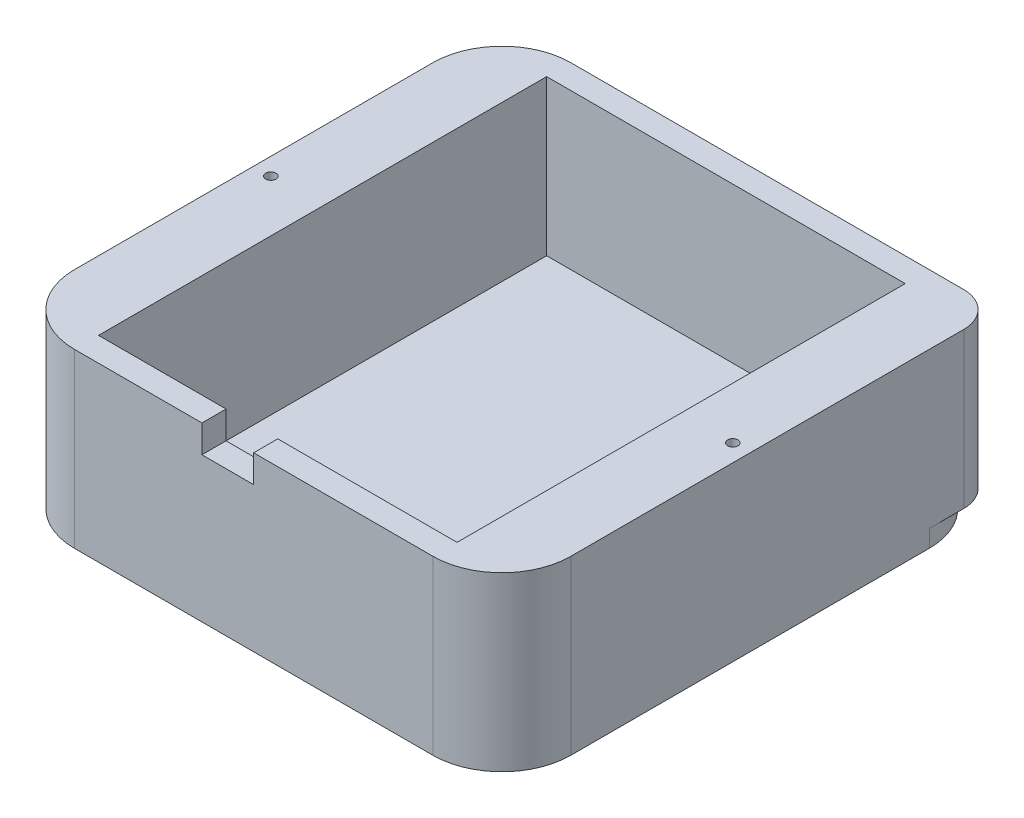
ISO-10303-21;
HEADER;
FILE_DESCRIPTION(('STEP AP214'),'2;1');
FILE_NAME('part.step','',(''),(''),'','','');
FILE_SCHEMA(('AUTOMOTIVE_DESIGN { 1 0 10303 214 1 1 1 1 }'));
ENDSEC;
DATA;
#1=APPLICATION_CONTEXT('core data for automotive mechanical design processes');
#2=APPLICATION_PROTOCOL_DEFINITION('international standard','automotive_design',2000,#1);
#3=PRODUCT_CONTEXT('',#1,'mechanical');
#4=PRODUCT('Part','Part','',(#3));
#5=PRODUCT_RELATED_PRODUCT_CATEGORY('part','',(#4));
#6=PRODUCT_DEFINITION_FORMATION('','',#4);
#7=PRODUCT_DEFINITION_CONTEXT('part definition',#1,'design');
#8=PRODUCT_DEFINITION('design','',#6,#7);
#9=PRODUCT_DEFINITION_SHAPE('','',#8);
#10=(LENGTH_UNIT() NAMED_UNIT(*) SI_UNIT(.MILLI.,.METRE.));
#11=(NAMED_UNIT(*) PLANE_ANGLE_UNIT() SI_UNIT($,.RADIAN.));
#12=(NAMED_UNIT(*) SI_UNIT($,.STERADIAN.) SOLID_ANGLE_UNIT());
#13=UNCERTAINTY_MEASURE_WITH_UNIT(LENGTH_MEASURE(1.E-05),#10,'distance_accuracy_value','');
#14=(GEOMETRIC_REPRESENTATION_CONTEXT(3) GLOBAL_UNCERTAINTY_ASSIGNED_CONTEXT((#13)) GLOBAL_UNIT_ASSIGNED_CONTEXT((#10,
#11,#12)) REPRESENTATION_CONTEXT('',''));
#15=CARTESIAN_POINT('',(0.,0.,0.));
#16=DIRECTION('',(0.,0.,1.));
#17=DIRECTION('',(1.,0.,0.));
#18=AXIS2_PLACEMENT_3D('',#15,#16,#17);
#19=CARTESIAN_POINT('',(72.,5.,-72.));
#20=DIRECTION('',(-1.,0.,0.));
#21=DIRECTION('',(0.,0.,1.));
#22=AXIS2_PLACEMENT_3D('',#19,#20,#21);
#23=PLANE('',#22);
#24=DIRECTION('',(0.,0.,-1.));
#25=VECTOR('',#24,1.);
#26=CARTESIAN_POINT('',(72.,0.,-72.));
#27=LINE('',#26,#25);
#28=CARTESIAN_POINT('',(72.,0.,52.));
#29=VERTEX_POINT('',#28);
#30=CARTESIAN_POINT('',(72.,0.,-52.));
#31=VERTEX_POINT('',#30);
#32=EDGE_CURVE('E221',#29,#31,#27,.T.);
#33=ORIENTED_EDGE('',*,*,#32,.T.);
#34=DIRECTION('',(0.,-1.,0.));
#35=VECTOR('',#34,1.);
#36=CARTESIAN_POINT('',(72.,5.,-52.));
#37=LINE('',#36,#35);
#38=CARTESIAN_POINT('',(72.,5.,-52.));
#39=VERTEX_POINT('',#38);
#40=EDGE_CURVE('E256',#31,#39,#37,.F.);
#41=ORIENTED_EDGE('',*,*,#40,.T.);
#42=DIRECTION('',(0.,0.,-1.));
#43=VECTOR('',#42,1.);
#44=CARTESIAN_POINT('',(72.,5.,-62.));
#45=LINE('',#44,#43);
#46=CARTESIAN_POINT('',(72.,5.,-62.));
#47=VERTEX_POINT('',#46);
#48=EDGE_CURVE('E207',#39,#47,#45,.T.);
#49=ORIENTED_EDGE('',*,*,#48,.T.);
#50=DIRECTION('',(0.,-1.,0.));
#51=VECTOR('',#50,1.);
#52=CARTESIAN_POINT('',(72.,50.,-62.));
#53=LINE('',#52,#51);
#54=CARTESIAN_POINT('',(72.,50.,-62.));
#55=VERTEX_POINT('',#54);
#56=EDGE_CURVE('E218',#55,#47,#53,.T.);
#57=ORIENTED_EDGE('',*,*,#56,.F.);
#58=DIRECTION('',(0.,0.,-1.));
#59=VECTOR('',#58,1.);
#60=CARTESIAN_POINT('',(72.,50.,-62.));
#61=LINE('',#60,#59);
#62=CARTESIAN_POINT('',(72.,50.,52.));
#63=VERTEX_POINT('',#62);
#64=EDGE_CURVE('E199',#63,#55,#61,.T.);
#65=ORIENTED_EDGE('',*,*,#64,.F.);
#66=DIRECTION('',(0.,-1.,0.));
#67=VECTOR('',#66,1.);
#68=CARTESIAN_POINT('',(72.,5.,52.));
#69=LINE('',#68,#67);
#70=EDGE_CURVE('E253',#63,#29,#69,.T.);
#71=ORIENTED_EDGE('',*,*,#70,.T.);
#72=EDGE_LOOP('',(#33,#41,#49,#57,#65,#71));
#73=FACE_BOUND('',#72,.T.);
#74=ADVANCED_FACE('F35',(#73),#23,.F.);
#75=CARTESIAN_POINT('',(-72.,5.,-72.));
#76=DIRECTION('',(0.,0.,1.));
#77=DIRECTION('',(1.,0.,0.));
#78=AXIS2_PLACEMENT_3D('',#75,#76,#77);
#79=PLANE('',#78);
#80=DIRECTION('',(-1.,0.,0.));
#81=VECTOR('',#80,1.);
#82=CARTESIAN_POINT('',(-72.,0.,-72.));
#83=LINE('',#82,#81);
#84=CARTESIAN_POINT('',(52.,0.,-72.));
#85=VERTEX_POINT('',#84);
#86=CARTESIAN_POINT('',(-52.,0.,-72.));
#87=VERTEX_POINT('',#86);
#88=EDGE_CURVE('E224',#85,#87,#83,.T.);
#89=ORIENTED_EDGE('',*,*,#88,.T.);
#90=DIRECTION('',(0.,-1.,0.));
#91=VECTOR('',#90,1.);
#92=CARTESIAN_POINT('',(-52.,5.,-72.));
#93=LINE('',#92,#91);
#94=CARTESIAN_POINT('',(-52.,50.,-72.));
#95=VERTEX_POINT('',#94);
#96=EDGE_CURVE('E248',#87,#95,#93,.F.);
#97=ORIENTED_EDGE('',*,*,#96,.T.);
#98=DIRECTION('',(-1.,0.,0.));
#99=VECTOR('',#98,1.);
#100=CARTESIAN_POINT('',(-52.,50.,-72.));
#101=LINE('',#100,#99);
#102=CARTESIAN_POINT('',(62.,50.,-72.));
#103=VERTEX_POINT('',#102);
#104=EDGE_CURVE('E203',#103,#95,#101,.T.);
#105=ORIENTED_EDGE('',*,*,#104,.F.);
#106=DIRECTION('',(0.,-1.,0.));
#107=VECTOR('',#106,1.);
#108=CARTESIAN_POINT('',(62.,50.,-72.));
#109=LINE('',#108,#107);
#110=CARTESIAN_POINT('',(62.,5.,-72.));
#111=VERTEX_POINT('',#110);
#112=EDGE_CURVE('E206',#103,#111,#109,.T.);
#113=ORIENTED_EDGE('',*,*,#112,.T.);
#114=DIRECTION('',(-1.,0.,0.));
#115=VECTOR('',#114,1.);
#116=CARTESIAN_POINT('',(-52.,5.,-72.));
#117=LINE('',#116,#115);
#118=CARTESIAN_POINT('',(52.,5.,-72.));
#119=VERTEX_POINT('',#118);
#120=EDGE_CURVE('E212',#111,#119,#117,.T.);
#121=ORIENTED_EDGE('',*,*,#120,.T.);
#122=DIRECTION('',(0.,-1.,0.));
#123=VECTOR('',#122,1.);
#124=CARTESIAN_POINT('',(52.,5.,-72.));
#125=LINE('',#124,#123);
#126=EDGE_CURVE('E245',#119,#85,#125,.T.);
#127=ORIENTED_EDGE('',*,*,#126,.T.);
#128=EDGE_LOOP('',(#89,#97,#105,#113,#121,#127));
#129=FACE_BOUND('',#128,.T.);
#130=ADVANCED_FACE('F347',(#129),#79,.F.);
#131=CARTESIAN_POINT('',(-72.,5.,-72.));
#132=DIRECTION('',(1.,0.,0.));
#133=DIRECTION('',(0.,0.,-1.));
#134=AXIS2_PLACEMENT_3D('',#131,#132,#133);
#135=PLANE('',#134);
#136=DIRECTION('',(0.,-1.,0.));
#137=VECTOR('',#136,1.);
#138=CARTESIAN_POINT('',(-72.,5.,52.));
#139=LINE('',#138,#137);
#140=CARTESIAN_POINT('',(-72.,0.,52.));
#141=VERTEX_POINT('',#140);
#142=CARTESIAN_POINT('',(-72.,50.,52.));
#143=VERTEX_POINT('',#142);
#144=EDGE_CURVE('E232',#141,#143,#139,.F.);
#145=ORIENTED_EDGE('',*,*,#144,.T.);
#146=DIRECTION('',(0.,0.,1.));
#147=VECTOR('',#146,1.);
#148=CARTESIAN_POINT('',(-72.,50.,-52.));
#149=LINE('',#148,#147);
#150=CARTESIAN_POINT('',(-72.,50.,-52.));
#151=VERTEX_POINT('',#150);
#152=EDGE_CURVE('E194',#151,#143,#149,.T.);
#153=ORIENTED_EDGE('',*,*,#152,.F.);
#154=DIRECTION('',(0.,-1.,0.));
#155=VECTOR('',#154,1.);
#156=CARTESIAN_POINT('',(-72.,5.,-52.));
#157=LINE('',#156,#155);
#158=CARTESIAN_POINT('',(-72.,0.,-52.));
#159=VERTEX_POINT('',#158);
#160=EDGE_CURVE('E234',#151,#159,#157,.T.);
#161=ORIENTED_EDGE('',*,*,#160,.T.);
#162=DIRECTION('',(0.,0.,1.));
#163=VECTOR('',#162,1.);
#164=CARTESIAN_POINT('',(-72.,0.,-72.));
#165=LINE('',#164,#163);
#166=EDGE_CURVE('E227',#159,#141,#165,.T.);
#167=ORIENTED_EDGE('',*,*,#166,.T.);
#168=EDGE_LOOP('',(#145,#153,#161,#167));
#169=FACE_BOUND('',#168,.T.);
#170=ADVANCED_FACE('F352',(#169),#135,.F.);
#171=CARTESIAN_POINT('',(-72.,5.,72.));
#172=DIRECTION('',(0.,0.,-1.));
#173=DIRECTION('',(-1.,0.,0.));
#174=AXIS2_PLACEMENT_3D('',#171,#172,#173);
#175=PLANE('',#174);
#176=DIRECTION('',(1.,0.,0.));
#177=VECTOR('',#176,1.);
#178=CARTESIAN_POINT('',(52.,50.,72.));
#179=LINE('',#178,#177);
#180=CARTESIAN_POINT('',(0.,50.,72.));
#181=VERTEX_POINT('',#180);
#182=CARTESIAN_POINT('',(52.,50.,72.));
#183=VERTEX_POINT('',#182);
#184=EDGE_CURVE('E176',#181,#183,#179,.T.);
#185=ORIENTED_EDGE('',*,*,#184,.F.);
#186=DIRECTION('',(0.,1.,0.));
#187=VECTOR('',#186,1.);
#188=CARTESIAN_POINT('',(0.,42.,72.));
#189=LINE('',#188,#187);
#190=CARTESIAN_POINT('',(0.,42.,72.));
#191=VERTEX_POINT('',#190);
#192=EDGE_CURVE('E159',#191,#181,#189,.T.);
#193=ORIENTED_EDGE('',*,*,#192,.F.);
#194=DIRECTION('',(1.,0.,0.));
#195=VECTOR('',#194,1.);
#196=CARTESIAN_POINT('',(-15.,42.,72.));
#197=LINE('',#196,#195);
#198=CARTESIAN_POINT('',(-15.,42.,72.));
#199=VERTEX_POINT('',#198);
#200=EDGE_CURVE('E181',#199,#191,#197,.T.);
#201=ORIENTED_EDGE('',*,*,#200,.F.);
#202=DIRECTION('',(0.,-1.,0.));
#203=VECTOR('',#202,1.);
#204=CARTESIAN_POINT('',(-15.,50.,72.));
#205=LINE('',#204,#203);
#206=CARTESIAN_POINT('',(-15.,50.,72.));
#207=VERTEX_POINT('',#206);
#208=EDGE_CURVE('E170',#207,#199,#205,.T.);
#209=ORIENTED_EDGE('',*,*,#208,.F.);
#210=CARTESIAN_POINT('',(-52.,50.,72.));
#211=VERTEX_POINT('',#210);
#212=EDGE_CURVE('E188',#211,#207,#179,.T.);
#213=ORIENTED_EDGE('',*,*,#212,.F.);
#214=DIRECTION('',(0.,-1.,0.));
#215=VECTOR('',#214,1.);
#216=CARTESIAN_POINT('',(-52.,5.,72.));
#217=LINE('',#216,#215);
#218=CARTESIAN_POINT('',(-52.,0.,72.));
#219=VERTEX_POINT('',#218);
#220=EDGE_CURVE('E259',#211,#219,#217,.T.);
#221=ORIENTED_EDGE('',*,*,#220,.T.);
#222=DIRECTION('',(1.,0.,0.));
#223=VECTOR('',#222,1.);
#224=CARTESIAN_POINT('',(-72.,0.,72.));
#225=LINE('',#224,#223);
#226=CARTESIAN_POINT('',(52.,0.,72.));
#227=VERTEX_POINT('',#226);
#228=EDGE_CURVE('E230',#219,#227,#225,.T.);
#229=ORIENTED_EDGE('',*,*,#228,.T.);
#230=DIRECTION('',(0.,-1.,0.));
#231=VECTOR('',#230,1.);
#232=CARTESIAN_POINT('',(52.,5.,72.));
#233=LINE('',#232,#231);
#234=EDGE_CURVE('E186',#227,#183,#233,.F.);
#235=ORIENTED_EDGE('',*,*,#234,.T.);
#236=EDGE_LOOP('',(#185,#193,#201,#209,#213,#221,#229,#235));
#237=FACE_BOUND('',#236,.T.);
#238=ADVANCED_FACE('F183',(#237),#175,.F.);
#239=CARTESIAN_POINT('',(0.,0.,0.));
#240=DIRECTION('',(0.,1.,0.));
#241=DIRECTION('',(0.,0.,1.));
#242=AXIS2_PLACEMENT_3D('',#239,#240,#241);
#243=PLANE('',#242);
#244=ORIENTED_EDGE('',*,*,#166,.F.);
#245=CARTESIAN_POINT('',(-52.,0.,-52.));
#246=DIRECTION('',(0.,1.,0.));
#247=DIRECTION('',(0.,0.,1.));
#248=AXIS2_PLACEMENT_3D('',#245,#246,#247);
#249=CIRCLE('',#248,20.);
#250=EDGE_CURVE('E243',#159,#87,#249,.F.);
#251=ORIENTED_EDGE('',*,*,#250,.T.);
#252=ORIENTED_EDGE('',*,*,#88,.F.);
#253=CARTESIAN_POINT('',(52.,0.,-52.));
#254=DIRECTION('',(0.,1.,0.));
#255=DIRECTION('',(0.,0.,1.));
#256=AXIS2_PLACEMENT_3D('',#253,#254,#255);
#257=CIRCLE('',#256,20.);
#258=EDGE_CURVE('E241',#85,#31,#257,.F.);
#259=ORIENTED_EDGE('',*,*,#258,.T.);
#260=ORIENTED_EDGE('',*,*,#32,.F.);
#261=CARTESIAN_POINT('',(52.,0.,52.));
#262=DIRECTION('',(0.,1.,0.));
#263=DIRECTION('',(0.,0.,1.));
#264=AXIS2_PLACEMENT_3D('',#261,#262,#263);
#265=CIRCLE('',#264,20.);
#266=EDGE_CURVE('E237',#29,#227,#265,.F.);
#267=ORIENTED_EDGE('',*,*,#266,.T.);
#268=ORIENTED_EDGE('',*,*,#228,.F.);
#269=CARTESIAN_POINT('',(-52.,0.,52.));
#270=DIRECTION('',(0.,1.,0.));
#271=DIRECTION('',(0.,0.,1.));
#272=AXIS2_PLACEMENT_3D('',#269,#270,#271);
#273=CIRCLE('',#272,20.);
#274=EDGE_CURVE('E239',#219,#141,#273,.F.);
#275=ORIENTED_EDGE('',*,*,#274,.T.);
#276=EDGE_LOOP('',(#244,#251,#252,#259,#260,#267,#268,#275));
#277=FACE_BOUND('',#276,.T.);
#278=ADVANCED_FACE('F332',(#277),#243,.F.);
#279=CARTESIAN_POINT('',(-52.,5.,-52.));
#280=DIRECTION('',(0.,-1.,0.));
#281=DIRECTION('',(0.,0.,-1.));
#282=AXIS2_PLACEMENT_3D('',#279,#280,#281);
#283=CYLINDRICAL_SURFACE('',#282,20.);
#284=ORIENTED_EDGE('',*,*,#160,.F.);
#285=CARTESIAN_POINT('',(-52.,50.,-52.));
#286=DIRECTION('',(0.,1.,0.));
#287=DIRECTION('',(0.,0.,-1.));
#288=AXIS2_PLACEMENT_3D('',#285,#286,#287);
#289=CIRCLE('',#288,20.);
#290=EDGE_CURVE('E215',#95,#151,#289,.T.);
#291=ORIENTED_EDGE('',*,*,#290,.F.);
#292=ORIENTED_EDGE('',*,*,#96,.F.);
#293=ORIENTED_EDGE('',*,*,#250,.F.);
#294=EDGE_LOOP('',(#284,#291,#292,#293));
#295=FACE_BOUND('',#294,.T.);
#296=ADVANCED_FACE('F351',(#295),#283,.T.);
#297=CARTESIAN_POINT('',(52.,5.,-52.));
#298=DIRECTION('',(0.,-1.,0.));
#299=DIRECTION('',(0.,0.,-1.));
#300=AXIS2_PLACEMENT_3D('',#297,#298,#299);
#301=CYLINDRICAL_SURFACE('',#300,20.);
#302=CARTESIAN_POINT('',(52.,5.,-52.));
#303=DIRECTION('',(0.,1.,0.));
#304=DIRECTION('',(0.,0.,1.));
#305=AXIS2_PLACEMENT_3D('',#302,#303,#304);
#306=CIRCLE('',#305,20.);
#307=EDGE_CURVE('E250',#39,#119,#306,.T.);
#308=ORIENTED_EDGE('',*,*,#307,.F.);
#309=ORIENTED_EDGE('',*,*,#40,.F.);
#310=ORIENTED_EDGE('',*,*,#258,.F.);
#311=ORIENTED_EDGE('',*,*,#126,.F.);
#312=EDGE_LOOP('',(#308,#309,#310,#311));
#313=FACE_BOUND('',#312,.T.);
#314=ADVANCED_FACE('F355',(#313),#301,.T.);
#315=CARTESIAN_POINT('',(-52.,5.,52.));
#316=DIRECTION('',(0.,-1.,0.));
#317=DIRECTION('',(0.,0.,-1.));
#318=AXIS2_PLACEMENT_3D('',#315,#316,#317);
#319=CYLINDRICAL_SURFACE('',#318,20.);
#320=ORIENTED_EDGE('',*,*,#220,.F.);
#321=CARTESIAN_POINT('',(-52.,50.,52.));
#322=DIRECTION('',(0.,1.,0.));
#323=DIRECTION('',(0.,0.,1.));
#324=AXIS2_PLACEMENT_3D('',#321,#322,#323);
#325=CIRCLE('',#324,20.);
#326=EDGE_CURVE('E189',#143,#211,#325,.T.);
#327=ORIENTED_EDGE('',*,*,#326,.F.);
#328=ORIENTED_EDGE('',*,*,#144,.F.);
#329=ORIENTED_EDGE('',*,*,#274,.F.);
#330=EDGE_LOOP('',(#320,#327,#328,#329));
#331=FACE_BOUND('',#330,.T.);
#332=ADVANCED_FACE('F328',(#331),#319,.T.);
#333=CARTESIAN_POINT('',(52.,5.,52.));
#334=DIRECTION('',(0.,-1.,0.));
#335=DIRECTION('',(0.,0.,-1.));
#336=AXIS2_PLACEMENT_3D('',#333,#334,#335);
#337=CYLINDRICAL_SURFACE('',#336,20.);
#338=ORIENTED_EDGE('',*,*,#70,.F.);
#339=CARTESIAN_POINT('',(52.,50.,52.));
#340=DIRECTION('',(0.,1.,0.));
#341=DIRECTION('',(0.,0.,-1.));
#342=AXIS2_PLACEMENT_3D('',#339,#340,#341);
#343=CIRCLE('',#342,20.);
#344=EDGE_CURVE('E192',#183,#63,#343,.T.);
#345=ORIENTED_EDGE('',*,*,#344,.F.);
#346=ORIENTED_EDGE('',*,*,#234,.F.);
#347=ORIENTED_EDGE('',*,*,#266,.F.);
#348=EDGE_LOOP('',(#338,#345,#346,#347));
#349=FACE_BOUND('',#348,.T.);
#350=ADVANCED_FACE('F37',(#349),#337,.T.);
#351=CARTESIAN_POINT('',(-52.,50.,-52.));
#352=DIRECTION('',(0.,-1.,0.));
#353=DIRECTION('',(0.,0.,-1.));
#354=AXIS2_PLACEMENT_3D('',#351,#352,#353);
#355=PLANE('',#354);
#356=CARTESIAN_POINT('',(67.,50.,0.));
#357=DIRECTION('',(0.,1.,0.));
#358=DIRECTION('',(0.,0.,-1.));
#359=AXIS2_PLACEMENT_3D('',#356,#357,#358);
#360=CIRCLE('',#359,1.5);
#361=CARTESIAN_POINT('',(67.,50.,1.49999999999999));
#362=VERTEX_POINT('',#361);
#363=EDGE_CURVE('E286',#362,#362,#360,.T.);
#364=ORIENTED_EDGE('',*,*,#363,.F.);
#365=EDGE_LOOP('',(#364));
#366=FACE_BOUND('',#365,.T.);
#367=CARTESIAN_POINT('',(-67.,50.,0.));
#368=DIRECTION('',(0.,1.,0.));
#369=DIRECTION('',(0.,0.,1.));
#370=AXIS2_PLACEMENT_3D('',#367,#368,#369);
#371=CIRCLE('',#370,1.5);
#372=CARTESIAN_POINT('',(-67.,50.,1.50000000000004));
#373=VERTEX_POINT('',#372);
#374=EDGE_CURVE('E292',#373,#373,#371,.T.);
#375=ORIENTED_EDGE('',*,*,#374,.F.);
#376=EDGE_LOOP('',(#375));
#377=FACE_BOUND('',#376,.T.);
#378=DIRECTION('',(1.,0.,0.));
#379=VECTOR('',#378,1.);
#380=CARTESIAN_POINT('',(-52.,50.,65.));
#381=LINE('',#380,#379);
#382=CARTESIAN_POINT('',(0.,50.,65.));
#383=VERTEX_POINT('',#382);
#384=CARTESIAN_POINT('',(52.,50.,65.));
#385=VERTEX_POINT('',#384);
#386=EDGE_CURVE('E179',#383,#385,#381,.T.);
#387=ORIENTED_EDGE('',*,*,#386,.F.);
#388=DIRECTION('',(0.,0.,1.));
#389=VECTOR('',#388,1.);
#390=CARTESIAN_POINT('',(0.,50.,64.));
#391=LINE('',#390,#389);
#392=EDGE_CURVE('E162',#383,#181,#391,.T.);
#393=ORIENTED_EDGE('',*,*,#392,.T.);
#394=ORIENTED_EDGE('',*,*,#184,.T.);
#395=ORIENTED_EDGE('',*,*,#344,.T.);
#396=ORIENTED_EDGE('',*,*,#64,.T.);
#397=CARTESIAN_POINT('',(61.9999999999995,50.,-61.9999999999995));
#398=DIRECTION('',(0.,1.,0.));
#399=DIRECTION('',(0.,0.,-1.));
#400=AXIS2_PLACEMENT_3D('',#397,#398,#399);
#401=CIRCLE('',#400,10.0000000000005);
#402=EDGE_CURVE('E201',#55,#103,#401,.T.);
#403=ORIENTED_EDGE('',*,*,#402,.T.);
#404=ORIENTED_EDGE('',*,*,#104,.T.);
#405=ORIENTED_EDGE('',*,*,#290,.T.);
#406=ORIENTED_EDGE('',*,*,#152,.T.);
#407=ORIENTED_EDGE('',*,*,#326,.T.);
#408=ORIENTED_EDGE('',*,*,#212,.T.);
#409=DIRECTION('',(0.,0.,1.));
#410=VECTOR('',#409,1.);
#411=CARTESIAN_POINT('',(-15.,50.,64.));
#412=LINE('',#411,#410);
#413=CARTESIAN_POINT('',(-15.,50.,65.));
#414=VERTEX_POINT('',#413);
#415=EDGE_CURVE('E180',#414,#207,#412,.T.);
#416=ORIENTED_EDGE('',*,*,#415,.F.);
#417=CARTESIAN_POINT('',(-52.,50.,65.));
#418=VERTEX_POINT('',#417);
#419=EDGE_CURVE('E272',#418,#414,#381,.T.);
#420=ORIENTED_EDGE('',*,*,#419,.F.);
#421=DIRECTION('',(0.,0.,1.));
#422=VECTOR('',#421,1.);
#423=CARTESIAN_POINT('',(-52.,50.,65.));
#424=LINE('',#423,#422);
#425=CARTESIAN_POINT('',(-52.,50.,-65.));
#426=VERTEX_POINT('',#425);
#427=EDGE_CURVE('E301',#426,#418,#424,.T.);
#428=ORIENTED_EDGE('',*,*,#427,.F.);
#429=DIRECTION('',(-1.,0.,0.));
#430=VECTOR('',#429,1.);
#431=CARTESIAN_POINT('',(-52.,50.,-65.));
#432=LINE('',#431,#430);
#433=CARTESIAN_POINT('',(52.,50.,-65.));
#434=VERTEX_POINT('',#433);
#435=EDGE_CURVE('E298',#434,#426,#432,.T.);
#436=ORIENTED_EDGE('',*,*,#435,.F.);
#437=DIRECTION('',(0.,0.,-1.));
#438=VECTOR('',#437,1.);
#439=CARTESIAN_POINT('',(52.,50.,65.));
#440=LINE('',#439,#438);
#441=EDGE_CURVE('E296',#385,#434,#440,.T.);
#442=ORIENTED_EDGE('',*,*,#441,.F.);
#443=EDGE_LOOP('',(#387,#393,#394,#395,#396,#403,#404,#405,#406,#407,#408,#416,#420,#428,#436,#442));
#444=FACE_BOUND('',#443,.T.);
#445=ADVANCED_FACE('F174',(#366,#377,#444),#355,.F.);
#446=CARTESIAN_POINT('',(-52.,5.,-52.));
#447=DIRECTION('',(0.,-1.,0.));
#448=DIRECTION('',(0.,0.,-1.));
#449=AXIS2_PLACEMENT_3D('',#446,#447,#448);
#450=PLANE('',#449);
#451=ORIENTED_EDGE('',*,*,#48,.F.);
#452=ORIENTED_EDGE('',*,*,#307,.T.);
#453=ORIENTED_EDGE('',*,*,#120,.F.);
#454=CARTESIAN_POINT('',(61.9999999999995,5.,-61.9999999999995));
#455=DIRECTION('',(0.,1.,0.));
#456=DIRECTION('',(0.,0.,-1.));
#457=AXIS2_PLACEMENT_3D('',#454,#455,#456);
#458=CIRCLE('',#457,10.0000000000005);
#459=EDGE_CURVE('E209',#47,#111,#458,.T.);
#460=ORIENTED_EDGE('',*,*,#459,.F.);
#461=EDGE_LOOP('',(#451,#452,#453,#460));
#462=FACE_BOUND('',#461,.T.);
#463=ADVANCED_FACE('F358',(#462),#450,.T.);
#464=CARTESIAN_POINT('',(61.9999999999995,50.,-61.9999999999995));
#465=DIRECTION('',(0.,-1.,0.));
#466=DIRECTION('',(0.,0.,-1.));
#467=AXIS2_PLACEMENT_3D('',#464,#465,#466);
#468=CYLINDRICAL_SURFACE('',#467,10.0000000000005);
#469=ORIENTED_EDGE('',*,*,#459,.T.);
#470=ORIENTED_EDGE('',*,*,#112,.F.);
#471=ORIENTED_EDGE('',*,*,#402,.F.);
#472=ORIENTED_EDGE('',*,*,#56,.T.);
#473=EDGE_LOOP('',(#469,#470,#471,#472));
#474=FACE_BOUND('',#473,.T.);
#475=ADVANCED_FACE('F343',(#474),#468,.T.);
#476=CARTESIAN_POINT('',(-52.,50.,65.));
#477=DIRECTION('',(0.,0.,-1.));
#478=DIRECTION('',(-1.,0.,0.));
#479=AXIS2_PLACEMENT_3D('',#476,#477,#478);
#480=PLANE('',#479);
#481=DIRECTION('',(0.,-1.,0.));
#482=VECTOR('',#481,1.);
#483=CARTESIAN_POINT('',(0.,50.,65.));
#484=LINE('',#483,#482);
#485=CARTESIAN_POINT('',(0.,42.,65.));
#486=VERTEX_POINT('',#485);
#487=EDGE_CURVE('E11',#383,#486,#484,.T.);
#488=ORIENTED_EDGE('',*,*,#487,.F.);
#489=ORIENTED_EDGE('',*,*,#386,.T.);
#490=DIRECTION('',(0.,-1.,0.));
#491=VECTOR('',#490,1.);
#492=CARTESIAN_POINT('',(52.,50.,65.));
#493=LINE('',#492,#491);
#494=CARTESIAN_POINT('',(52.,5.,65.));
#495=VERTEX_POINT('',#494);
#496=EDGE_CURVE('E210',#385,#495,#493,.T.);
#497=ORIENTED_EDGE('',*,*,#496,.T.);
#498=DIRECTION('',(1.,0.,0.));
#499=VECTOR('',#498,1.);
#500=CARTESIAN_POINT('',(-52.,5.,65.));
#501=LINE('',#500,#499);
#502=CARTESIAN_POINT('',(-52.,5.,65.));
#503=VERTEX_POINT('',#502);
#504=EDGE_CURVE('E285',#503,#495,#501,.T.);
#505=ORIENTED_EDGE('',*,*,#504,.F.);
#506=DIRECTION('',(0.,-1.,0.));
#507=VECTOR('',#506,1.);
#508=CARTESIAN_POINT('',(-52.,50.,65.));
#509=LINE('',#508,#507);
#510=EDGE_CURVE('E303',#418,#503,#509,.T.);
#511=ORIENTED_EDGE('',*,*,#510,.F.);
#512=ORIENTED_EDGE('',*,*,#419,.T.);
#513=DIRECTION('',(0.,1.,0.));
#514=VECTOR('',#513,1.);
#515=CARTESIAN_POINT('',(-15.,50.,65.));
#516=LINE('',#515,#514);
#517=CARTESIAN_POINT('',(-15.,42.,65.));
#518=VERTEX_POINT('',#517);
#519=EDGE_CURVE('E262',#518,#414,#516,.T.);
#520=ORIENTED_EDGE('',*,*,#519,.F.);
#521=DIRECTION('',(-1.,0.,0.));
#522=VECTOR('',#521,1.);
#523=CARTESIAN_POINT('',(-52.,42.,65.));
#524=LINE('',#523,#522);
#525=EDGE_CURVE('E43',#486,#518,#524,.T.);
#526=ORIENTED_EDGE('',*,*,#525,.F.);
#527=EDGE_LOOP('',(#488,#489,#497,#505,#511,#512,#520,#526));
#528=FACE_BOUND('',#527,.T.);
#529=ADVANCED_FACE('F269',(#528),#480,.T.);
#530=CARTESIAN_POINT('',(52.,50.,65.));
#531=DIRECTION('',(-1.,0.,0.));
#532=DIRECTION('',(0.,0.,1.));
#533=AXIS2_PLACEMENT_3D('',#530,#531,#532);
#534=PLANE('',#533);
#535=DIRECTION('',(0.,0.,-1.));
#536=VECTOR('',#535,1.);
#537=CARTESIAN_POINT('',(52.,5.,65.));
#538=LINE('',#537,#536);
#539=CARTESIAN_POINT('',(52.,5.,-65.));
#540=VERTEX_POINT('',#539);
#541=EDGE_CURVE('E306',#495,#540,#538,.T.);
#542=ORIENTED_EDGE('',*,*,#541,.F.);
#543=ORIENTED_EDGE('',*,*,#496,.F.);
#544=ORIENTED_EDGE('',*,*,#441,.T.);
#545=DIRECTION('',(0.,-1.,0.));
#546=VECTOR('',#545,1.);
#547=CARTESIAN_POINT('',(52.,50.,-65.));
#548=LINE('',#547,#546);
#549=EDGE_CURVE('E316',#434,#540,#548,.T.);
#550=ORIENTED_EDGE('',*,*,#549,.T.);
#551=EDGE_LOOP('',(#542,#543,#544,#550));
#552=FACE_BOUND('',#551,.T.);
#553=ADVANCED_FACE('F404',(#552),#534,.T.);
#554=CARTESIAN_POINT('',(-52.,50.,-65.));
#555=DIRECTION('',(0.,0.,1.));
#556=DIRECTION('',(1.,0.,0.));
#557=AXIS2_PLACEMENT_3D('',#554,#555,#556);
#558=PLANE('',#557);
#559=DIRECTION('',(-1.,0.,0.));
#560=VECTOR('',#559,1.);
#561=CARTESIAN_POINT('',(-52.,5.,-65.));
#562=LINE('',#561,#560);
#563=CARTESIAN_POINT('',(-52.,5.,-65.));
#564=VERTEX_POINT('',#563);
#565=EDGE_CURVE('E309',#540,#564,#562,.T.);
#566=ORIENTED_EDGE('',*,*,#565,.F.);
#567=ORIENTED_EDGE('',*,*,#549,.F.);
#568=ORIENTED_EDGE('',*,*,#435,.T.);
#569=DIRECTION('',(0.,-1.,0.));
#570=VECTOR('',#569,1.);
#571=CARTESIAN_POINT('',(-52.,50.,-65.));
#572=LINE('',#571,#570);
#573=EDGE_CURVE('E314',#426,#564,#572,.T.);
#574=ORIENTED_EDGE('',*,*,#573,.T.);
#575=EDGE_LOOP('',(#566,#567,#568,#574));
#576=FACE_BOUND('',#575,.T.);
#577=ADVANCED_FACE('F457',(#576),#558,.T.);
#578=CARTESIAN_POINT('',(-52.,50.,65.));
#579=DIRECTION('',(1.,0.,0.));
#580=DIRECTION('',(0.,0.,-1.));
#581=AXIS2_PLACEMENT_3D('',#578,#579,#580);
#582=PLANE('',#581);
#583=DIRECTION('',(0.,0.,1.));
#584=VECTOR('',#583,1.);
#585=CARTESIAN_POINT('',(-52.,5.,65.));
#586=LINE('',#585,#584);
#587=EDGE_CURVE('E58',#564,#503,#586,.T.);
#588=ORIENTED_EDGE('',*,*,#587,.F.);
#589=ORIENTED_EDGE('',*,*,#573,.F.);
#590=ORIENTED_EDGE('',*,*,#427,.T.);
#591=ORIENTED_EDGE('',*,*,#510,.T.);
#592=EDGE_LOOP('',(#588,#589,#590,#591));
#593=FACE_BOUND('',#592,.T.);
#594=ADVANCED_FACE('F454',(#593),#582,.T.);
#595=CARTESIAN_POINT('',(0.,5.,0.));
#596=DIRECTION('',(0.,1.,0.));
#597=DIRECTION('',(0.,0.,1.));
#598=AXIS2_PLACEMENT_3D('',#595,#596,#597);
#599=PLANE('',#598);
#600=ORIENTED_EDGE('',*,*,#565,.T.);
#601=ORIENTED_EDGE('',*,*,#587,.T.);
#602=ORIENTED_EDGE('',*,*,#504,.T.);
#603=ORIENTED_EDGE('',*,*,#541,.T.);
#604=EDGE_LOOP('',(#600,#601,#602,#603));
#605=FACE_BOUND('',#604,.T.);
#606=ADVANCED_FACE('F452',(#605),#599,.T.);
#607=CARTESIAN_POINT('',(-67.,37.,0.));
#608=DIRECTION('',(0.,1.,0.));
#609=DIRECTION('',(0.,0.,1.));
#610=AXIS2_PLACEMENT_3D('',#607,#608,#609);
#611=CYLINDRICAL_SURFACE('',#610,1.5);
#612=CARTESIAN_POINT('',(-67.,37.,0.));
#613=DIRECTION('',(0.,1.,0.));
#614=DIRECTION('',(0.,0.,1.));
#615=AXIS2_PLACEMENT_3D('',#612,#613,#614);
#616=CIRCLE('',#615,1.5);
#617=CARTESIAN_POINT('',(-67.,37.,1.50000000000004));
#618=VERTEX_POINT('',#617);
#619=EDGE_CURVE('E289',#618,#618,#616,.T.);
#620=CARTESIAN_POINT('',(-67.,37.,1.50000000000004));
#621=CARTESIAN_POINT('',(-67.,37.1354166666667,1.50000000000004));
#622=CARTESIAN_POINT('',(-67.,37.2708333333333,1.50000000000004));
#623=CARTESIAN_POINT('',(-67.,37.5416666666667,1.50000000000004));
#624=CARTESIAN_POINT('',(-67.,37.6770833333333,1.50000000000004));
#625=CARTESIAN_POINT('',(-67.,37.9479166666667,1.50000000000004));
#626=CARTESIAN_POINT('',(-67.,38.0833333333333,1.50000000000004));
#627=CARTESIAN_POINT('',(-67.,38.3541666666667,1.50000000000004));
#628=CARTESIAN_POINT('',(-67.,38.4895833333333,1.50000000000004));
#629=CARTESIAN_POINT('',(-67.,38.7604166666667,1.50000000000004));
#630=CARTESIAN_POINT('',(-67.,38.8958333333333,1.50000000000004));
#631=CARTESIAN_POINT('',(-67.,39.1666666666667,1.50000000000004));
#632=CARTESIAN_POINT('',(-67.,39.3020833333333,1.50000000000004));
#633=CARTESIAN_POINT('',(-67.,39.5729166666667,1.50000000000004));
#634=CARTESIAN_POINT('',(-67.,39.7083333333333,1.50000000000004));
#635=CARTESIAN_POINT('',(-67.,39.9791666666667,1.50000000000004));
#636=CARTESIAN_POINT('',(-67.,40.1145833333333,1.50000000000004));
#637=CARTESIAN_POINT('',(-67.,40.3854166666667,1.50000000000004));
#638=CARTESIAN_POINT('',(-67.,40.5208333333333,1.50000000000004));
#639=CARTESIAN_POINT('',(-67.,40.7916666666667,1.50000000000004));
#640=CARTESIAN_POINT('',(-67.,40.9270833333333,1.50000000000004));
#641=CARTESIAN_POINT('',(-67.,41.1979166666667,1.50000000000004));
#642=CARTESIAN_POINT('',(-67.,41.3333333333333,1.50000000000004));
#643=CARTESIAN_POINT('',(-67.,41.6041666666667,1.50000000000004));
#644=CARTESIAN_POINT('',(-67.,41.7395833333333,1.50000000000004));
#645=CARTESIAN_POINT('',(-67.,42.0104166666667,1.50000000000004));
#646=CARTESIAN_POINT('',(-67.,42.1458333333333,1.50000000000004));
#647=CARTESIAN_POINT('',(-67.,42.4166666666667,1.50000000000004));
#648=CARTESIAN_POINT('',(-67.,42.5520833333333,1.50000000000004));
#649=CARTESIAN_POINT('',(-67.,42.8229166666667,1.50000000000004));
#650=CARTESIAN_POINT('',(-67.,42.9583333333333,1.50000000000004));
#651=CARTESIAN_POINT('',(-67.,43.2291666666667,1.50000000000004));
#652=CARTESIAN_POINT('',(-67.,43.3645833333333,1.50000000000004));
#653=CARTESIAN_POINT('',(-67.,43.6354166666667,1.50000000000004));
#654=CARTESIAN_POINT('',(-67.,43.7708333333333,1.50000000000004));
#655=CARTESIAN_POINT('',(-67.,44.0416666666667,1.50000000000004));
#656=CARTESIAN_POINT('',(-67.,44.1770833333333,1.50000000000004));
#657=CARTESIAN_POINT('',(-67.,44.4479166666667,1.50000000000004));
#658=CARTESIAN_POINT('',(-67.,44.5833333333333,1.50000000000004));
#659=CARTESIAN_POINT('',(-67.,44.8541666666667,1.50000000000004));
#660=CARTESIAN_POINT('',(-67.,44.9895833333333,1.50000000000004));
#661=CARTESIAN_POINT('',(-67.,45.2604166666667,1.50000000000004));
#662=CARTESIAN_POINT('',(-67.,45.3958333333333,1.50000000000004));
#663=CARTESIAN_POINT('',(-67.,45.6666666666667,1.50000000000004));
#664=CARTESIAN_POINT('',(-67.,45.8020833333333,1.50000000000004));
#665=CARTESIAN_POINT('',(-67.,46.0729166666667,1.50000000000004));
#666=CARTESIAN_POINT('',(-67.,46.2083333333333,1.50000000000004));
#667=CARTESIAN_POINT('',(-67.,46.4791666666667,1.50000000000004));
#668=CARTESIAN_POINT('',(-67.,46.6145833333333,1.50000000000004));
#669=CARTESIAN_POINT('',(-67.,46.8854166666667,1.50000000000004));
#670=CARTESIAN_POINT('',(-67.,47.0208333333333,1.50000000000004));
#671=CARTESIAN_POINT('',(-67.,47.2916666666667,1.50000000000004));
#672=CARTESIAN_POINT('',(-67.,47.4270833333333,1.50000000000004));
#673=CARTESIAN_POINT('',(-67.,47.6979166666667,1.50000000000004));
#674=CARTESIAN_POINT('',(-67.,47.8333333333333,1.50000000000004));
#675=CARTESIAN_POINT('',(-67.,48.1041666666667,1.50000000000004));
#676=CARTESIAN_POINT('',(-67.,48.2395833333333,1.50000000000004));
#677=CARTESIAN_POINT('',(-67.,48.5104166666667,1.50000000000004));
#678=CARTESIAN_POINT('',(-67.,48.6458333333333,1.50000000000004));
#679=CARTESIAN_POINT('',(-67.,48.9166666666667,1.50000000000004));
#680=CARTESIAN_POINT('',(-67.,49.0520833333333,1.50000000000004));
#681=CARTESIAN_POINT('',(-67.,49.3229166666667,1.50000000000004));
#682=CARTESIAN_POINT('',(-67.,49.4583333333333,1.50000000000004));
#683=CARTESIAN_POINT('',(-67.,49.7291666666667,1.50000000000004));
#684=CARTESIAN_POINT('',(-67.,49.8645833333333,1.50000000000004));
#685=CARTESIAN_POINT('',(-67.,50.,1.50000000000004));
#686=B_SPLINE_CURVE_WITH_KNOTS('',3,(#620,#621,#622,#623,#624,#625,#626,#627,#628,#629,#630,
#631,#632,#633,#634,#635,#636,#637,#638,#639,#640,#641,#642,#643,#644,#645,#646,#647,#648,#649,
#650,#651,#652,#653,#654,#655,#656,#657,#658,#659,#660,#661,#662,#663,#664,#665,#666,#667,#668,
#669,#670,#671,#672,#673,#674,#675,#676,#677,#678,#679,#680,#681,#682,#683,#684,#685),
.UNSPECIFIED.,.F.,.F.,(4,2,2,2,2,2,2,2,2,2,2,2,2,2,2,2,2,2,2,2,2,2,2,2,2,2,2,2,2,2,2,2,4),(0.,
0.406249999999997,0.812499999999994,1.21875,1.62499999999999,2.03125,2.4375,2.84375,3.25,
3.65624999999999,4.0625,4.46874999999999,4.875,5.28124999999999,5.6875,6.09374999999999,6.5,
6.90625,7.31249999999999,7.71875,8.12499999999999,8.53125,8.93749999999999,9.34375,
9.74999999999999,10.15625,10.5625,10.96875,11.375,11.78125,12.1875,12.59375,13.),.UNSPECIFIED.);
#687=EDGE_CURVE('BSEAM448',#618,#373,#686,.T.);
#688=ORIENTED_EDGE('',*,*,#619,.F.);
#689=ORIENTED_EDGE('',*,*,#374,.T.);
#690=ORIENTED_EDGE('',*,*,#687,.T.);
#691=ORIENTED_EDGE('',*,*,#687,.F.);
#692=EDGE_LOOP('',(#688,#690,#689,#691));
#693=FACE_BOUND('',#692,.T.);
#694=ADVANCED_FACE('F448',(#693),#611,.F.);
#695=CARTESIAN_POINT('',(-67.,37.,0.));
#696=DIRECTION('',(0.,1.,0.));
#697=DIRECTION('',(0.,0.,1.));
#698=AXIS2_PLACEMENT_3D('',#695,#696,#697);
#699=PLANE('',#698);
#700=ORIENTED_EDGE('',*,*,#619,.T.);
#701=EDGE_LOOP('',(#700));
#702=FACE_BOUND('',#701,.T.);
#703=ADVANCED_FACE('F444',(#702),#699,.T.);
#704=CARTESIAN_POINT('',(67.,37.,0.));
#705=DIRECTION('',(0.,1.,0.));
#706=DIRECTION('',(0.,0.,1.));
#707=AXIS2_PLACEMENT_3D('',#704,#705,#706);
#708=CYLINDRICAL_SURFACE('',#707,1.5);
#709=CARTESIAN_POINT('',(67.,37.,0.));
#710=DIRECTION('',(0.,1.,0.));
#711=DIRECTION('',(0.,0.,-1.));
#712=AXIS2_PLACEMENT_3D('',#709,#710,#711);
#713=CIRCLE('',#712,1.5);
#714=CARTESIAN_POINT('',(67.,37.,1.49999999999999));
#715=VERTEX_POINT('',#714);
#716=EDGE_CURVE('E282',#715,#715,#713,.T.);
#717=CARTESIAN_POINT('',(67.,37.,1.49999999999999));
#718=CARTESIAN_POINT('',(67.,37.1354166666667,1.49999999999999));
#719=CARTESIAN_POINT('',(67.,37.2708333333333,1.49999999999999));
#720=CARTESIAN_POINT('',(67.,37.5416666666667,1.49999999999999));
#721=CARTESIAN_POINT('',(67.,37.6770833333333,1.49999999999999));
#722=CARTESIAN_POINT('',(67.,37.9479166666667,1.49999999999999));
#723=CARTESIAN_POINT('',(67.,38.0833333333333,1.49999999999999));
#724=CARTESIAN_POINT('',(67.,38.3541666666667,1.49999999999999));
#725=CARTESIAN_POINT('',(67.,38.4895833333333,1.49999999999999));
#726=CARTESIAN_POINT('',(67.,38.7604166666667,1.49999999999999));
#727=CARTESIAN_POINT('',(67.,38.8958333333333,1.49999999999999));
#728=CARTESIAN_POINT('',(67.,39.1666666666667,1.49999999999999));
#729=CARTESIAN_POINT('',(67.,39.3020833333333,1.49999999999999));
#730=CARTESIAN_POINT('',(67.,39.5729166666667,1.49999999999999));
#731=CARTESIAN_POINT('',(67.,39.7083333333333,1.49999999999999));
#732=CARTESIAN_POINT('',(67.,39.9791666666667,1.49999999999999));
#733=CARTESIAN_POINT('',(67.,40.1145833333333,1.49999999999999));
#734=CARTESIAN_POINT('',(67.,40.3854166666667,1.49999999999999));
#735=CARTESIAN_POINT('',(67.,40.5208333333333,1.49999999999999));
#736=CARTESIAN_POINT('',(67.,40.7916666666667,1.49999999999999));
#737=CARTESIAN_POINT('',(67.,40.9270833333333,1.49999999999999));
#738=CARTESIAN_POINT('',(67.,41.1979166666667,1.49999999999999));
#739=CARTESIAN_POINT('',(67.,41.3333333333333,1.49999999999999));
#740=CARTESIAN_POINT('',(67.,41.6041666666667,1.49999999999999));
#741=CARTESIAN_POINT('',(67.,41.7395833333333,1.49999999999999));
#742=CARTESIAN_POINT('',(67.,42.0104166666667,1.49999999999999));
#743=CARTESIAN_POINT('',(67.,42.1458333333333,1.49999999999999));
#744=CARTESIAN_POINT('',(67.,42.4166666666667,1.49999999999999));
#745=CARTESIAN_POINT('',(67.,42.5520833333333,1.49999999999999));
#746=CARTESIAN_POINT('',(67.,42.8229166666667,1.49999999999999));
#747=CARTESIAN_POINT('',(67.,42.9583333333333,1.49999999999999));
#748=CARTESIAN_POINT('',(67.,43.2291666666667,1.49999999999999));
#749=CARTESIAN_POINT('',(67.,43.3645833333333,1.49999999999999));
#750=CARTESIAN_POINT('',(67.,43.6354166666667,1.49999999999999));
#751=CARTESIAN_POINT('',(67.,43.7708333333333,1.49999999999999));
#752=CARTESIAN_POINT('',(67.,44.0416666666667,1.49999999999999));
#753=CARTESIAN_POINT('',(67.,44.1770833333333,1.49999999999999));
#754=CARTESIAN_POINT('',(67.,44.4479166666667,1.49999999999999));
#755=CARTESIAN_POINT('',(67.,44.5833333333333,1.49999999999999));
#756=CARTESIAN_POINT('',(67.,44.8541666666667,1.49999999999999));
#757=CARTESIAN_POINT('',(67.,44.9895833333333,1.49999999999999));
#758=CARTESIAN_POINT('',(67.,45.2604166666667,1.49999999999999));
#759=CARTESIAN_POINT('',(67.,45.3958333333333,1.49999999999999));
#760=CARTESIAN_POINT('',(67.,45.6666666666667,1.49999999999999));
#761=CARTESIAN_POINT('',(67.,45.8020833333333,1.49999999999999));
#762=CARTESIAN_POINT('',(67.,46.0729166666667,1.49999999999999));
#763=CARTESIAN_POINT('',(67.,46.2083333333333,1.49999999999999));
#764=CARTESIAN_POINT('',(67.,46.4791666666667,1.49999999999999));
#765=CARTESIAN_POINT('',(67.,46.6145833333333,1.49999999999999));
#766=CARTESIAN_POINT('',(67.,46.8854166666667,1.49999999999999));
#767=CARTESIAN_POINT('',(67.,47.0208333333333,1.49999999999999));
#768=CARTESIAN_POINT('',(67.,47.2916666666667,1.49999999999999));
#769=CARTESIAN_POINT('',(67.,47.4270833333333,1.49999999999999));
#770=CARTESIAN_POINT('',(67.,47.6979166666667,1.49999999999999));
#771=CARTESIAN_POINT('',(67.,47.8333333333333,1.49999999999999));
#772=CARTESIAN_POINT('',(67.,48.1041666666667,1.49999999999999));
#773=CARTESIAN_POINT('',(67.,48.2395833333333,1.49999999999999));
#774=CARTESIAN_POINT('',(67.,48.5104166666667,1.49999999999999));
#775=CARTESIAN_POINT('',(67.,48.6458333333333,1.49999999999999));
#776=CARTESIAN_POINT('',(67.,48.9166666666667,1.49999999999999));
#777=CARTESIAN_POINT('',(67.,49.0520833333333,1.49999999999999));
#778=CARTESIAN_POINT('',(67.,49.3229166666667,1.49999999999999));
#779=CARTESIAN_POINT('',(67.,49.4583333333333,1.49999999999999));
#780=CARTESIAN_POINT('',(67.,49.7291666666667,1.49999999999999));
#781=CARTESIAN_POINT('',(67.,49.8645833333333,1.49999999999999));
#782=CARTESIAN_POINT('',(67.,50.,1.49999999999999));
#783=B_SPLINE_CURVE_WITH_KNOTS('',3,(#717,#718,#719,#720,#721,#722,#723,#724,#725,#726,#727,
#728,#729,#730,#731,#732,#733,#734,#735,#736,#737,#738,#739,#740,#741,#742,#743,#744,#745,#746,
#747,#748,#749,#750,#751,#752,#753,#754,#755,#756,#757,#758,#759,#760,#761,#762,#763,#764,#765,
#766,#767,#768,#769,#770,#771,#772,#773,#774,#775,#776,#777,#778,#779,#780,#781,#782),
.UNSPECIFIED.,.F.,.F.,(4,2,2,2,2,2,2,2,2,2,2,2,2,2,2,2,2,2,2,2,2,2,2,2,2,2,2,2,2,2,2,2,4),(0.,
0.406249999999997,0.812499999999994,1.21875,1.62499999999999,2.03125,2.4375,2.84375,3.25,
3.65624999999999,4.0625,4.46874999999999,4.875,5.28124999999999,5.6875,6.09374999999999,6.5,
6.90625,7.31249999999999,7.71875,8.12499999999999,8.53125,8.93749999999999,9.34375,
9.74999999999999,10.15625,10.5625,10.96875,11.375,11.78125,12.1875,12.59375,13.),.UNSPECIFIED.);
#784=EDGE_CURVE('BSEAM440',#715,#362,#783,.T.);
#785=ORIENTED_EDGE('',*,*,#716,.F.);
#786=ORIENTED_EDGE('',*,*,#363,.T.);
#787=ORIENTED_EDGE('',*,*,#784,.T.);
#788=ORIENTED_EDGE('',*,*,#784,.F.);
#789=EDGE_LOOP('',(#785,#787,#786,#788));
#790=FACE_BOUND('',#789,.T.);
#791=ADVANCED_FACE('F440',(#790),#708,.F.);
#792=CARTESIAN_POINT('',(67.,37.,0.));
#793=DIRECTION('',(0.,-1.,0.));
#794=DIRECTION('',(0.,0.,-1.));
#795=AXIS2_PLACEMENT_3D('',#792,#793,#794);
#796=PLANE('',#795);
#797=ORIENTED_EDGE('',*,*,#716,.T.);
#798=EDGE_LOOP('',(#797));
#799=FACE_BOUND('',#798,.T.);
#800=ADVANCED_FACE('F416',(#799),#796,.F.);
#801=CARTESIAN_POINT('',(0.,42.,64.));
#802=DIRECTION('',(1.,0.,0.));
#803=DIRECTION('',(0.,0.,-1.));
#804=AXIS2_PLACEMENT_3D('',#801,#802,#803);
#805=PLANE('',#804);
#806=ORIENTED_EDGE('',*,*,#487,.T.);
#807=DIRECTION('',(0.,0.,1.));
#808=VECTOR('',#807,1.);
#809=CARTESIAN_POINT('',(0.,42.,64.));
#810=LINE('',#809,#808);
#811=EDGE_CURVE('E165',#486,#191,#810,.T.);
#812=ORIENTED_EDGE('',*,*,#811,.T.);
#813=ORIENTED_EDGE('',*,*,#192,.T.);
#814=ORIENTED_EDGE('',*,*,#392,.F.);
#815=EDGE_LOOP('',(#806,#812,#813,#814));
#816=FACE_BOUND('',#815,.T.);
#817=ADVANCED_FACE('F161',(#816),#805,.F.);
#818=CARTESIAN_POINT('',(-15.,42.,64.));
#819=DIRECTION('',(0.,-1.,0.));
#820=DIRECTION('',(0.,0.,-1.));
#821=AXIS2_PLACEMENT_3D('',#818,#819,#820);
#822=PLANE('',#821);
#823=ORIENTED_EDGE('',*,*,#525,.T.);
#824=DIRECTION('',(0.,0.,1.));
#825=VECTOR('',#824,1.);
#826=CARTESIAN_POINT('',(-15.,42.,64.));
#827=LINE('',#826,#825);
#828=EDGE_CURVE('E50',#518,#199,#827,.T.);
#829=ORIENTED_EDGE('',*,*,#828,.T.);
#830=ORIENTED_EDGE('',*,*,#200,.T.);
#831=ORIENTED_EDGE('',*,*,#811,.F.);
#832=EDGE_LOOP('',(#823,#829,#830,#831));
#833=FACE_BOUND('',#832,.T.);
#834=ADVANCED_FACE('F266',(#833),#822,.F.);
#835=CARTESIAN_POINT('',(-15.,50.,64.));
#836=DIRECTION('',(-1.,0.,0.));
#837=DIRECTION('',(0.,0.,1.));
#838=AXIS2_PLACEMENT_3D('',#835,#836,#837);
#839=PLANE('',#838);
#840=ORIENTED_EDGE('',*,*,#519,.T.);
#841=ORIENTED_EDGE('',*,*,#415,.T.);
#842=ORIENTED_EDGE('',*,*,#208,.T.);
#843=ORIENTED_EDGE('',*,*,#828,.F.);
#844=EDGE_LOOP('',(#840,#841,#842,#843));
#845=FACE_BOUND('',#844,.T.);
#846=ADVANCED_FACE('F274',(#845),#839,.F.);
#847=CLOSED_SHELL('',(#74,#130,#170,#238,#278,#296,#314,#332,#350,#445,#463,#475,#529,#553,#577,
#594,#606,#694,#703,#791,#800,#817,#834,#846));
#848=MANIFOLD_SOLID_BREP('B2',#847);
#849=ADVANCED_BREP_SHAPE_REPRESENTATION('',(#18,#848),#14);
#850=SHAPE_DEFINITION_REPRESENTATION(#9,#849);
ENDSEC;
END-ISO-10303-21;
